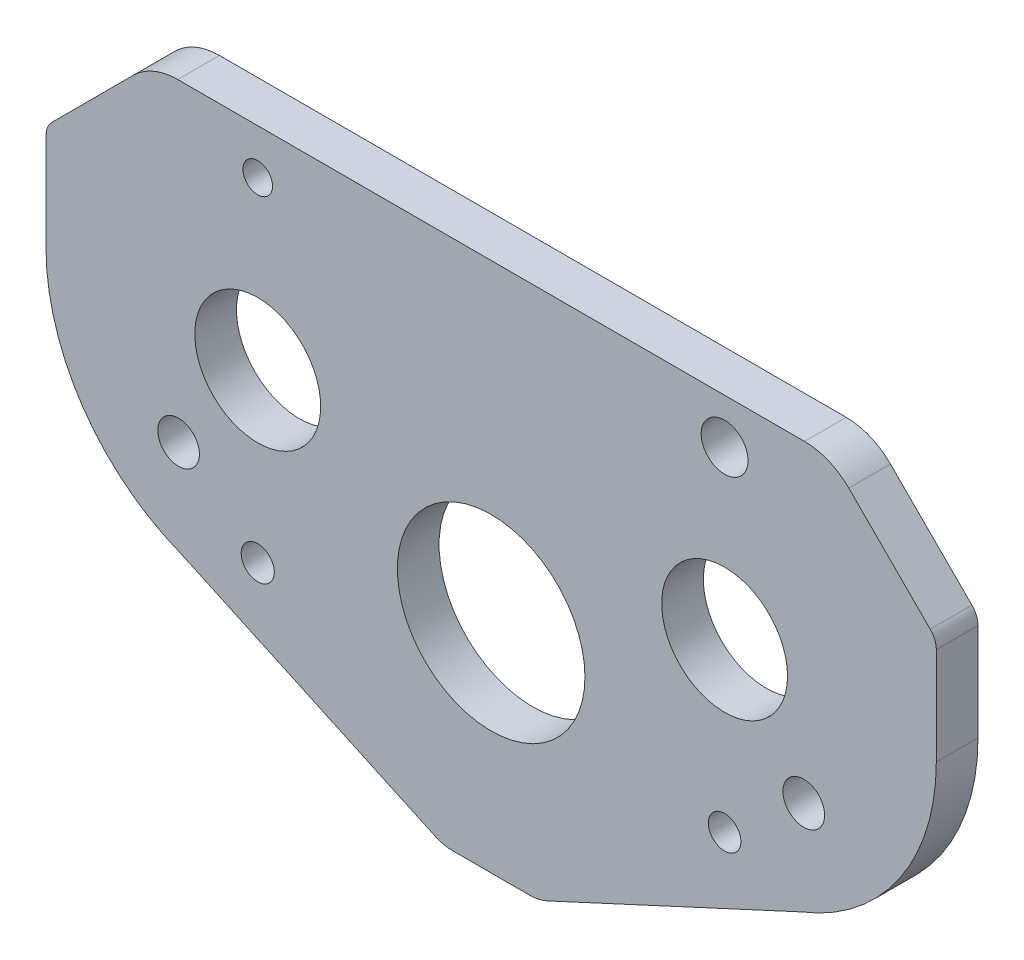
ISO-10303-21;
HEADER;
FILE_DESCRIPTION(('STEP AP214'),'2;1');
FILE_NAME('part.step','',(''),(''),'','','');
FILE_SCHEMA(('AUTOMOTIVE_DESIGN { 1 0 10303 214 1 1 1 1 }'));
ENDSEC;
DATA;
#1=APPLICATION_CONTEXT('core data for automotive mechanical design processes');
#2=APPLICATION_PROTOCOL_DEFINITION('international standard','automotive_design',2000,#1);
#3=PRODUCT_CONTEXT('',#1,'mechanical');
#4=PRODUCT('Part','Part','',(#3));
#5=PRODUCT_RELATED_PRODUCT_CATEGORY('part','',(#4));
#6=PRODUCT_DEFINITION_FORMATION('','',#4);
#7=PRODUCT_DEFINITION_CONTEXT('part definition',#1,'design');
#8=PRODUCT_DEFINITION('design','',#6,#7);
#9=PRODUCT_DEFINITION_SHAPE('','',#8);
#10=(LENGTH_UNIT() NAMED_UNIT(*) SI_UNIT(.MILLI.,.METRE.));
#11=(NAMED_UNIT(*) PLANE_ANGLE_UNIT() SI_UNIT($,.RADIAN.));
#12=(NAMED_UNIT(*) SI_UNIT($,.STERADIAN.) SOLID_ANGLE_UNIT());
#13=UNCERTAINTY_MEASURE_WITH_UNIT(LENGTH_MEASURE(1.E-05),#10,'distance_accuracy_value','');
#14=(GEOMETRIC_REPRESENTATION_CONTEXT(3) GLOBAL_UNCERTAINTY_ASSIGNED_CONTEXT((#13)) GLOBAL_UNIT_ASSIGNED_CONTEXT((#10,
#11,#12)) REPRESENTATION_CONTEXT('',''));
#15=CARTESIAN_POINT('',(0.,0.,0.));
#16=DIRECTION('',(0.,0.,1.));
#17=DIRECTION('',(1.,0.,0.));
#18=AXIS2_PLACEMENT_3D('',#15,#16,#17);
#19=CARTESIAN_POINT('',(35.563882812585,15.5408971662744,3.175));
#20=DIRECTION('',(0.,0.,1.));
#21=DIRECTION('',(1.,0.,0.));
#22=AXIS2_PLACEMENT_3D('',#19,#20,#21);
#23=PLANE('',#22);
#24=CARTESIAN_POINT('',(35.5638828125851,-9.85910283372568,3.175));
#25=DIRECTION('',(0.,0.,1.));
#26=DIRECTION('',(1.,0.,0.));
#27=AXIS2_PLACEMENT_3D('',#24,#25,#26);
#28=CIRCLE('',#27,2.48146877651786);
#29=CARTESIAN_POINT('',(38.045351589103,-9.85910283372568,3.175));
#30=VERTEX_POINT('',#29);
#31=EDGE_CURVE('E599',#30,#30,#28,.T.);
#32=ORIENTED_EDGE('',*,*,#31,.F.);
#33=EDGE_LOOP('',(#32));
#34=FACE_BOUND('',#33,.T.);
#35=CARTESIAN_POINT('',(-35.5638828125851,40.9408971662743,3.175));
#36=DIRECTION('',(0.,0.,1.));
#37=DIRECTION('',(1.,0.,0.));
#38=AXIS2_PLACEMENT_3D('',#35,#36,#37);
#39=CIRCLE('',#38,2.25727893057174);
#40=CARTESIAN_POINT('',(-33.3066038820134,40.9408971662743,3.175));
#41=VERTEX_POINT('',#40);
#42=EDGE_CURVE('E587',#41,#41,#39,.T.);
#43=ORIENTED_EDGE('',*,*,#42,.F.);
#44=EDGE_LOOP('',(#43));
#45=FACE_BOUND('',#44,.T.);
#46=CARTESIAN_POINT('',(-47.625,0.,3.175));
#47=DIRECTION('',(0.,0.,1.));
#48=DIRECTION('',(1.,0.,0.));
#49=AXIS2_PLACEMENT_3D('',#46,#47,#48);
#50=CIRCLE('',#49,3.17500000000001);
#51=CARTESIAN_POINT('',(-44.45,0.,3.175));
#52=VERTEX_POINT('',#51);
#53=EDGE_CURVE('E575',#52,#52,#50,.T.);
#54=ORIENTED_EDGE('',*,*,#53,.F.);
#55=EDGE_LOOP('',(#54));
#56=FACE_BOUND('',#55,.T.);
#57=CARTESIAN_POINT('',(35.5638828125851,15.5408971662743,3.175));
#58=DIRECTION('',(0.,0.,1.));
#59=DIRECTION('',(1.,0.,0.));
#60=AXIS2_PLACEMENT_3D('',#57,#58,#59);
#61=CIRCLE('',#60,9.58850000000001);
#62=CARTESIAN_POINT('',(45.1523828125851,15.5408971662743,3.175));
#63=VERTEX_POINT('',#62);
#64=EDGE_CURVE('E563',#63,#63,#61,.T.);
#65=ORIENTED_EDGE('',*,*,#64,.F.);
#66=EDGE_LOOP('',(#65));
#67=FACE_BOUND('',#66,.T.);
#68=DIRECTION('',(1.,0.,0.));
#69=VECTOR('',#68,1.);
#70=CARTESIAN_POINT('',(-7.26457678024273,-33.02,3.175));
#71=LINE('',#70,#69);
#72=CARTESIAN_POINT('',(-5.86754278404221,-33.02,3.175));
#73=VERTEX_POINT('',#72);
#74=CARTESIAN_POINT('',(5.86754278404219,-33.02,3.175));
#75=VERTEX_POINT('',#74);
#76=EDGE_CURVE('E175',#73,#75,#71,.T.);
#77=ORIENTED_EDGE('',*,*,#76,.T.);
#78=CARTESIAN_POINT('',(5.86754278404219,-26.67,3.175));
#79=DIRECTION('',(0.,0.,1.));
#80=DIRECTION('',(1.,0.,0.));
#81=AXIS2_PLACEMENT_3D('',#78,#79,#80);
#82=CIRCLE('',#81,6.35);
#83=CARTESIAN_POINT('',(8.53261500301202,-32.4336698437432,3.175));
#84=VERTEX_POINT('',#83);
#85=EDGE_CURVE('E41',#75,#84,#82,.T.);
#86=ORIENTED_EDGE('',*,*,#85,.T.);
#87=DIRECTION('',(0.907664542321771,0.419696412436193,0.));
#88=VECTOR('',#87,1.);
#89=CARTESIAN_POINT('',(47.3213543831485,-14.4980846118651,3.175));
#90=LINE('',#89,#88);
#91=CARTESIAN_POINT('',(47.3213543831485,-14.4980846118651,3.175));
#92=VERTEX_POINT('',#91);
#93=EDGE_CURVE('E180',#84,#92,#90,.T.);
#94=ORIENTED_EDGE('',*,*,#93,.T.);
#95=CARTESIAN_POINT('',(35.563882812585,15.5408971662744,3.175));
#96=DIRECTION('',(0.,0.,1.));
#97=DIRECTION('',(1.,0.,0.));
#98=AXIS2_PLACEMENT_3D('',#95,#96,#97);
#99=CIRCLE('',#98,32.2580000000001);
#100=CARTESIAN_POINT('',(67.8218828125851,15.5408971662743,3.175));
#101=VERTEX_POINT('',#100);
#102=EDGE_CURVE('E182',#92,#101,#99,.T.);
#103=ORIENTED_EDGE('',*,*,#102,.T.);
#104=DIRECTION('',(0.,1.,0.));
#105=VECTOR('',#104,1.);
#106=CARTESIAN_POINT('',(67.8218828125851,31.6698971662743,3.175));
#107=LINE('',#106,#105);
#108=CARTESIAN_POINT('',(67.8218828125851,30.3547691057397,3.175));
#109=VERTEX_POINT('',#108);
#110=EDGE_CURVE('E184',#101,#109,#107,.T.);
#111=ORIENTED_EDGE('',*,*,#110,.T.);
#112=CARTESIAN_POINT('',(64.6468828125851,30.3547691057397,3.175));
#113=DIRECTION('',(0.,0.,1.));
#114=DIRECTION('',(1.,0.,0.));
#115=AXIS2_PLACEMENT_3D('',#112,#113,#114);
#116=CIRCLE('',#115,3.175);
#117=CARTESIAN_POINT('',(66.8919468428524,32.599833136007,3.175));
#118=VERTEX_POINT('',#117);
#119=EDGE_CURVE('E249',#109,#118,#116,.T.);
#120=ORIENTED_EDGE('',*,*,#119,.T.);
#121=DIRECTION('',(-0.707106781186548,0.707106781186548,0.));
#122=VECTOR('',#121,1.);
#123=CARTESIAN_POINT('',(51.6928828125851,47.7988971662743,3.175));
#124=LINE('',#123,#122);
#125=CARTESIAN_POINT('',(54.4826907217832,45.0090892570762,3.175));
#126=VERTEX_POINT('',#125);
#127=EDGE_CURVE('E187',#118,#126,#124,.T.);
#128=ORIENTED_EDGE('',*,*,#127,.T.);
#129=CARTESIAN_POINT('',(47.7474986309814,38.2738971662743,3.175));
#130=DIRECTION('',(0.,0.,1.));
#131=DIRECTION('',(1.,0.,0.));
#132=AXIS2_PLACEMENT_3D('',#129,#130,#131);
#133=CIRCLE('',#132,9.525);
#134=CARTESIAN_POINT('',(47.7474986309813,47.7988971662743,3.175));
#135=VERTEX_POINT('',#134);
#136=EDGE_CURVE('E234',#126,#135,#133,.T.);
#137=ORIENTED_EDGE('',*,*,#136,.T.);
#138=DIRECTION('',(-1.,0.,0.));
#139=VECTOR('',#138,1.);
#140=CARTESIAN_POINT('',(-51.6928828125851,47.7988971662743,3.175));
#141=LINE('',#140,#139);
#142=CARTESIAN_POINT('',(-47.7474986309814,47.7988971662743,3.175));
#143=VERTEX_POINT('',#142);
#144=EDGE_CURVE('E213',#135,#143,#141,.T.);
#145=ORIENTED_EDGE('',*,*,#144,.T.);
#146=CARTESIAN_POINT('',(-47.7474986309814,38.2738971662743,3.175));
#147=DIRECTION('',(0.,0.,1.));
#148=DIRECTION('',(1.,0.,0.));
#149=AXIS2_PLACEMENT_3D('',#146,#147,#148);
#150=CIRCLE('',#149,9.525);
#151=CARTESIAN_POINT('',(-54.4826907217832,45.0090892570762,3.175));
#152=VERTEX_POINT('',#151);
#153=EDGE_CURVE('E232',#143,#152,#150,.T.);
#154=ORIENTED_EDGE('',*,*,#153,.T.);
#155=DIRECTION('',(-0.707106781186548,-0.707106781186548,0.));
#156=VECTOR('',#155,1.);
#157=CARTESIAN_POINT('',(-67.8218828125851,31.6698971662743,3.175));
#158=LINE('',#157,#156);
#159=CARTESIAN_POINT('',(-66.8919468428524,32.599833136007,3.175));
#160=VERTEX_POINT('',#159);
#161=EDGE_CURVE('E159',#152,#160,#158,.T.);
#162=ORIENTED_EDGE('',*,*,#161,.T.);
#163=CARTESIAN_POINT('',(-64.6468828125851,30.3547691057397,3.175));
#164=DIRECTION('',(0.,0.,1.));
#165=DIRECTION('',(1.,0.,0.));
#166=AXIS2_PLACEMENT_3D('',#163,#164,#165);
#167=CIRCLE('',#166,3.175);
#168=CARTESIAN_POINT('',(-67.8218828125851,30.3547691057397,3.175));
#169=VERTEX_POINT('',#168);
#170=EDGE_CURVE('E155',#160,#169,#167,.T.);
#171=ORIENTED_EDGE('',*,*,#170,.T.);
#172=DIRECTION('',(0.,-1.,0.));
#173=VECTOR('',#172,1.);
#174=CARTESIAN_POINT('',(-67.8218828125851,15.5408971662743,3.175));
#175=LINE('',#174,#173);
#176=CARTESIAN_POINT('',(-67.8218828125851,15.5408971662743,3.175));
#177=VERTEX_POINT('',#176);
#178=EDGE_CURVE('E147',#169,#177,#175,.T.);
#179=ORIENTED_EDGE('',*,*,#178,.T.);
#180=CARTESIAN_POINT('',(-35.5638828125849,15.5408971662744,3.175));
#181=DIRECTION('',(0.,0.,1.));
#182=DIRECTION('',(-1.,0.,0.));
#183=AXIS2_PLACEMENT_3D('',#180,#181,#182);
#184=CIRCLE('',#183,32.2580000000002);
#185=CARTESIAN_POINT('',(-47.3213543831485,-14.4980846118651,3.175));
#186=VERTEX_POINT('',#185);
#187=EDGE_CURVE('E151',#177,#186,#184,.T.);
#188=ORIENTED_EDGE('',*,*,#187,.T.);
#189=DIRECTION('',(0.90766454232177,-0.419696412436193,0.));
#190=VECTOR('',#189,1.);
#191=CARTESIAN_POINT('',(-47.3213543831485,-14.4980846118651,3.175));
#192=LINE('',#191,#190);
#193=CARTESIAN_POINT('',(-8.53261500301204,-32.4336698437432,3.175));
#194=VERTEX_POINT('',#193);
#195=EDGE_CURVE('E173',#186,#194,#192,.T.);
#196=ORIENTED_EDGE('',*,*,#195,.T.);
#197=CARTESIAN_POINT('',(-5.86754278404221,-26.67,3.175));
#198=DIRECTION('',(0.,0.,1.));
#199=DIRECTION('',(1.,0.,0.));
#200=AXIS2_PLACEMENT_3D('',#197,#198,#199);
#201=CIRCLE('',#200,6.35);
#202=EDGE_CURVE('E266',#194,#73,#201,.T.);
#203=ORIENTED_EDGE('',*,*,#202,.T.);
#204=EDGE_LOOP('',(#77,#86,#94,#103,#111,#120,#128,#137,#145,#154,#162,#171,#179,#188,#196,#203));
#205=FACE_BOUND('',#204,.T.);
#206=CARTESIAN_POINT('',(0.,0.,3.175));
#207=DIRECTION('',(0.,0.,1.));
#208=DIRECTION('',(1.,0.,0.));
#209=AXIS2_PLACEMENT_3D('',#206,#207,#208);
#210=CIRCLE('',#209,14.2875);
#211=CARTESIAN_POINT('',(14.2875,0.,3.175));
#212=VERTEX_POINT('',#211);
#213=EDGE_CURVE('E193',#212,#212,#210,.T.);
#214=ORIENTED_EDGE('',*,*,#213,.F.);
#215=EDGE_LOOP('',(#214));
#216=FACE_BOUND('',#215,.T.);
#217=CARTESIAN_POINT('',(-35.5638828125851,15.5408971662743,3.175));
#218=DIRECTION('',(0.,0.,1.));
#219=DIRECTION('',(1.,0.,0.));
#220=AXIS2_PLACEMENT_3D('',#217,#218,#219);
#221=CIRCLE('',#220,9.5885);
#222=CARTESIAN_POINT('',(-25.9753828125851,15.5408971662743,3.175));
#223=VERTEX_POINT('',#222);
#224=EDGE_CURVE('E569',#223,#223,#221,.T.);
#225=ORIENTED_EDGE('',*,*,#224,.F.);
#226=EDGE_LOOP('',(#225));
#227=FACE_BOUND('',#226,.T.);
#228=CARTESIAN_POINT('',(47.625,0.,3.175));
#229=DIRECTION('',(0.,0.,1.));
#230=DIRECTION('',(1.,0.,0.));
#231=AXIS2_PLACEMENT_3D('',#228,#229,#230);
#232=CIRCLE('',#231,3.17500000000001);
#233=CARTESIAN_POINT('',(50.8,0.,3.175));
#234=VERTEX_POINT('',#233);
#235=EDGE_CURVE('E581',#234,#234,#232,.T.);
#236=ORIENTED_EDGE('',*,*,#235,.F.);
#237=EDGE_LOOP('',(#236));
#238=FACE_BOUND('',#237,.T.);
#239=CARTESIAN_POINT('',(-35.5638828125851,-9.85910283372568,3.175));
#240=DIRECTION('',(0.,0.,1.));
#241=DIRECTION('',(1.,0.,0.));
#242=AXIS2_PLACEMENT_3D('',#239,#240,#241);
#243=CIRCLE('',#242,2.5219894842726);
#244=CARTESIAN_POINT('',(-33.0418933283125,-9.85910283372568,3.175));
#245=VERTEX_POINT('',#244);
#246=EDGE_CURVE('E593',#245,#245,#243,.T.);
#247=ORIENTED_EDGE('',*,*,#246,.F.);
#248=EDGE_LOOP('',(#247));
#249=FACE_BOUND('',#248,.T.);
#250=CARTESIAN_POINT('',(35.5638828125851,40.9408971662743,3.175));
#251=DIRECTION('',(0.,0.,1.));
#252=DIRECTION('',(1.,0.,0.));
#253=AXIS2_PLACEMENT_3D('',#250,#251,#252);
#254=CIRCLE('',#253,3.56711136624443);
#255=CARTESIAN_POINT('',(39.1309941788295,40.9408971662743,3.175));
#256=VERTEX_POINT('',#255);
#257=EDGE_CURVE('E605',#256,#256,#254,.T.);
#258=ORIENTED_EDGE('',*,*,#257,.F.);
#259=EDGE_LOOP('',(#258));
#260=FACE_BOUND('',#259,.T.);
#261=ADVANCED_FACE('F33',(#34,#45,#56,#67,#205,#216,#227,#238,#249,#260),#23,.T.);
#262=CARTESIAN_POINT('',(35.563882812585,15.5408971662744,-3.175));
#263=DIRECTION('',(0.,0.,1.));
#264=DIRECTION('',(1.,0.,0.));
#265=AXIS2_PLACEMENT_3D('',#262,#263,#264);
#266=PLANE('',#265);
#267=CARTESIAN_POINT('',(35.5638828125851,-9.85910283372568,-3.175));
#268=DIRECTION('',(0.,0.,1.));
#269=DIRECTION('',(1.,0.,0.));
#270=AXIS2_PLACEMENT_3D('',#267,#268,#269);
#271=CIRCLE('',#270,2.48146877651786);
#272=CARTESIAN_POINT('',(38.045351589103,-9.85910283372568,-3.175));
#273=VERTEX_POINT('',#272);
#274=EDGE_CURVE('E602',#273,#273,#271,.T.);
#275=ORIENTED_EDGE('',*,*,#274,.T.);
#276=EDGE_LOOP('',(#275));
#277=FACE_BOUND('',#276,.T.);
#278=CARTESIAN_POINT('',(-35.5638828125851,40.9408971662743,-3.175));
#279=DIRECTION('',(0.,0.,1.));
#280=DIRECTION('',(1.,0.,0.));
#281=AXIS2_PLACEMENT_3D('',#278,#279,#280);
#282=CIRCLE('',#281,2.25727893057174);
#283=CARTESIAN_POINT('',(-33.3066038820134,40.9408971662743,-3.175));
#284=VERTEX_POINT('',#283);
#285=EDGE_CURVE('E590',#284,#284,#282,.T.);
#286=ORIENTED_EDGE('',*,*,#285,.T.);
#287=EDGE_LOOP('',(#286));
#288=FACE_BOUND('',#287,.T.);
#289=CARTESIAN_POINT('',(-47.625,0.,-3.175));
#290=DIRECTION('',(0.,0.,1.));
#291=DIRECTION('',(1.,0.,0.));
#292=AXIS2_PLACEMENT_3D('',#289,#290,#291);
#293=CIRCLE('',#292,3.17500000000001);
#294=CARTESIAN_POINT('',(-44.45,0.,-3.175));
#295=VERTEX_POINT('',#294);
#296=EDGE_CURVE('E578',#295,#295,#293,.T.);
#297=ORIENTED_EDGE('',*,*,#296,.T.);
#298=EDGE_LOOP('',(#297));
#299=FACE_BOUND('',#298,.T.);
#300=CARTESIAN_POINT('',(35.5638828125851,15.5408971662743,-3.175));
#301=DIRECTION('',(0.,0.,1.));
#302=DIRECTION('',(1.,0.,0.));
#303=AXIS2_PLACEMENT_3D('',#300,#301,#302);
#304=CIRCLE('',#303,9.58850000000001);
#305=CARTESIAN_POINT('',(45.1523828125851,15.5408971662743,-3.175));
#306=VERTEX_POINT('',#305);
#307=EDGE_CURVE('E566',#306,#306,#304,.T.);
#308=ORIENTED_EDGE('',*,*,#307,.T.);
#309=EDGE_LOOP('',(#308));
#310=FACE_BOUND('',#309,.T.);
#311=DIRECTION('',(0.907664542321771,0.419696412436193,0.));
#312=VECTOR('',#311,1.);
#313=CARTESIAN_POINT('',(47.3213543831485,-14.4980846118651,-3.175));
#314=LINE('',#313,#312);
#315=CARTESIAN_POINT('',(8.53261500301202,-32.4336698437432,-3.175));
#316=VERTEX_POINT('',#315);
#317=CARTESIAN_POINT('',(47.3213543831485,-14.4980846118651,-3.175));
#318=VERTEX_POINT('',#317);
#319=EDGE_CURVE('E201',#316,#318,#314,.T.);
#320=ORIENTED_EDGE('',*,*,#319,.F.);
#321=CARTESIAN_POINT('',(5.86754278404219,-26.67,-3.175));
#322=DIRECTION('',(0.,0.,1.));
#323=DIRECTION('',(1.,0.,0.));
#324=AXIS2_PLACEMENT_3D('',#321,#322,#323);
#325=CIRCLE('',#324,6.35);
#326=CARTESIAN_POINT('',(5.86754278404219,-33.02,-3.175));
#327=VERTEX_POINT('',#326);
#328=EDGE_CURVE('E260',#316,#327,#325,.F.);
#329=ORIENTED_EDGE('',*,*,#328,.T.);
#330=DIRECTION('',(1.,0.,0.));
#331=VECTOR('',#330,1.);
#332=CARTESIAN_POINT('',(-7.26457678024273,-33.02,-3.175));
#333=LINE('',#332,#331);
#334=CARTESIAN_POINT('',(-5.86754278404221,-33.02,-3.175));
#335=VERTEX_POINT('',#334);
#336=EDGE_CURVE('E199',#335,#327,#333,.T.);
#337=ORIENTED_EDGE('',*,*,#336,.F.);
#338=CARTESIAN_POINT('',(-5.86754278404221,-26.67,-3.175));
#339=DIRECTION('',(0.,0.,1.));
#340=DIRECTION('',(1.,0.,0.));
#341=AXIS2_PLACEMENT_3D('',#338,#339,#340);
#342=CIRCLE('',#341,6.35);
#343=CARTESIAN_POINT('',(-8.53261500301204,-32.4336698437432,-3.175));
#344=VERTEX_POINT('',#343);
#345=EDGE_CURVE('E258',#335,#344,#342,.F.);
#346=ORIENTED_EDGE('',*,*,#345,.T.);
#347=DIRECTION('',(0.90766454232177,-0.419696412436193,0.));
#348=VECTOR('',#347,1.);
#349=CARTESIAN_POINT('',(-47.3213543831485,-14.4980846118651,-3.175));
#350=LINE('',#349,#348);
#351=CARTESIAN_POINT('',(-47.3213543831485,-14.4980846118651,-3.175));
#352=VERTEX_POINT('',#351);
#353=EDGE_CURVE('E197',#352,#344,#350,.T.);
#354=ORIENTED_EDGE('',*,*,#353,.F.);
#355=CARTESIAN_POINT('',(-35.5638828125849,15.5408971662744,-3.175));
#356=DIRECTION('',(0.,0.,1.));
#357=DIRECTION('',(-1.,0.,0.));
#358=AXIS2_PLACEMENT_3D('',#355,#356,#357);
#359=CIRCLE('',#358,32.2580000000002);
#360=CARTESIAN_POINT('',(-67.8218828125851,15.5408971662743,-3.175));
#361=VERTEX_POINT('',#360);
#362=EDGE_CURVE('E195',#361,#352,#359,.T.);
#363=ORIENTED_EDGE('',*,*,#362,.F.);
#364=DIRECTION('',(0.,-1.,0.));
#365=VECTOR('',#364,1.);
#366=CARTESIAN_POINT('',(-67.8218828125851,15.5408971662743,-3.175));
#367=LINE('',#366,#365);
#368=CARTESIAN_POINT('',(-67.8218828125851,30.3547691057397,-3.175));
#369=VERTEX_POINT('',#368);
#370=EDGE_CURVE('E165',#369,#361,#367,.T.);
#371=ORIENTED_EDGE('',*,*,#370,.F.);
#372=CARTESIAN_POINT('',(-64.6468828125851,30.3547691057397,-3.175));
#373=DIRECTION('',(0.,0.,1.));
#374=DIRECTION('',(1.,0.,0.));
#375=AXIS2_PLACEMENT_3D('',#372,#373,#374);
#376=CIRCLE('',#375,3.175);
#377=CARTESIAN_POINT('',(-66.8919468428524,32.599833136007,-3.175));
#378=VERTEX_POINT('',#377);
#379=EDGE_CURVE('E242',#369,#378,#376,.F.);
#380=ORIENTED_EDGE('',*,*,#379,.T.);
#381=DIRECTION('',(-0.707106781186548,-0.707106781186548,0.));
#382=VECTOR('',#381,1.);
#383=CARTESIAN_POINT('',(-67.8218828125851,31.6698971662743,-3.175));
#384=LINE('',#383,#382);
#385=CARTESIAN_POINT('',(-54.4826907217832,45.0090892570762,-3.175));
#386=VERTEX_POINT('',#385);
#387=EDGE_CURVE('E190',#386,#378,#384,.T.);
#388=ORIENTED_EDGE('',*,*,#387,.F.);
#389=CARTESIAN_POINT('',(-47.7474986309814,38.2738971662743,-3.175));
#390=DIRECTION('',(0.,0.,1.));
#391=DIRECTION('',(1.,0.,0.));
#392=AXIS2_PLACEMENT_3D('',#389,#390,#391);
#393=CIRCLE('',#392,9.525);
#394=CARTESIAN_POINT('',(-47.7474986309814,47.7988971662743,-3.175));
#395=VERTEX_POINT('',#394);
#396=EDGE_CURVE('E224',#386,#395,#393,.F.);
#397=ORIENTED_EDGE('',*,*,#396,.T.);
#398=DIRECTION('',(-1.,0.,0.));
#399=VECTOR('',#398,1.);
#400=CARTESIAN_POINT('',(-35.5638828125851,47.7988971662743,-3.175));
#401=LINE('',#400,#399);
#402=CARTESIAN_POINT('',(47.7474986309814,47.7988971662743,-3.175));
#403=VERTEX_POINT('',#402);
#404=EDGE_CURVE('E210',#403,#395,#401,.T.);
#405=ORIENTED_EDGE('',*,*,#404,.F.);
#406=CARTESIAN_POINT('',(47.7474986309814,38.2738971662743,-3.175));
#407=DIRECTION('',(0.,0.,1.));
#408=DIRECTION('',(1.,0.,0.));
#409=AXIS2_PLACEMENT_3D('',#406,#407,#408);
#410=CIRCLE('',#409,9.525);
#411=CARTESIAN_POINT('',(54.4826907217832,45.0090892570762,-3.175));
#412=VERTEX_POINT('',#411);
#413=EDGE_CURVE('E226',#403,#412,#410,.F.);
#414=ORIENTED_EDGE('',*,*,#413,.T.);
#415=DIRECTION('',(-0.707106781186548,0.707106781186548,0.));
#416=VECTOR('',#415,1.);
#417=CARTESIAN_POINT('',(51.6928828125851,47.7988971662743,-3.175));
#418=LINE('',#417,#416);
#419=CARTESIAN_POINT('',(66.8919468428524,32.599833136007,-3.175));
#420=VERTEX_POINT('',#419);
#421=EDGE_CURVE('E208',#420,#412,#418,.T.);
#422=ORIENTED_EDGE('',*,*,#421,.F.);
#423=CARTESIAN_POINT('',(64.6468828125851,30.3547691057397,-3.175));
#424=DIRECTION('',(0.,0.,1.));
#425=DIRECTION('',(1.,0.,0.));
#426=AXIS2_PLACEMENT_3D('',#423,#424,#425);
#427=CIRCLE('',#426,3.175);
#428=CARTESIAN_POINT('',(67.8218828125851,30.3547691057397,-3.175));
#429=VERTEX_POINT('',#428);
#430=EDGE_CURVE('E244',#420,#429,#427,.F.);
#431=ORIENTED_EDGE('',*,*,#430,.T.);
#432=DIRECTION('',(0.,1.,0.));
#433=VECTOR('',#432,1.);
#434=CARTESIAN_POINT('',(67.8218828125851,31.6698971662743,-3.175));
#435=LINE('',#434,#433);
#436=CARTESIAN_POINT('',(67.8218828125851,15.5408971662743,-3.175));
#437=VERTEX_POINT('',#436);
#438=EDGE_CURVE('E205',#437,#429,#435,.T.);
#439=ORIENTED_EDGE('',*,*,#438,.F.);
#440=CARTESIAN_POINT('',(35.563882812585,15.5408971662744,-3.175));
#441=DIRECTION('',(0.,0.,1.));
#442=DIRECTION('',(1.,0.,0.));
#443=AXIS2_PLACEMENT_3D('',#440,#441,#442);
#444=CIRCLE('',#443,32.2580000000001);
#445=EDGE_CURVE('E203',#318,#437,#444,.T.);
#446=ORIENTED_EDGE('',*,*,#445,.F.);
#447=EDGE_LOOP('',(#320,#329,#337,#346,#354,#363,#371,#380,#388,#397,#405,#414,#422,#431,#439,#446));
#448=FACE_BOUND('',#447,.T.);
#449=CARTESIAN_POINT('',(0.,0.,-3.175));
#450=DIRECTION('',(0.,0.,1.));
#451=DIRECTION('',(1.,0.,0.));
#452=AXIS2_PLACEMENT_3D('',#449,#450,#451);
#453=CIRCLE('',#452,14.2875);
#454=CARTESIAN_POINT('',(14.2875,0.,-3.175));
#455=VERTEX_POINT('',#454);
#456=EDGE_CURVE('E560',#455,#455,#453,.T.);
#457=ORIENTED_EDGE('',*,*,#456,.T.);
#458=EDGE_LOOP('',(#457));
#459=FACE_BOUND('',#458,.T.);
#460=CARTESIAN_POINT('',(-35.5638828125851,15.5408971662743,-3.175));
#461=DIRECTION('',(0.,0.,1.));
#462=DIRECTION('',(1.,0.,0.));
#463=AXIS2_PLACEMENT_3D('',#460,#461,#462);
#464=CIRCLE('',#463,9.5885);
#465=CARTESIAN_POINT('',(-25.9753828125851,15.5408971662743,-3.175));
#466=VERTEX_POINT('',#465);
#467=EDGE_CURVE('E572',#466,#466,#464,.T.);
#468=ORIENTED_EDGE('',*,*,#467,.T.);
#469=EDGE_LOOP('',(#468));
#470=FACE_BOUND('',#469,.T.);
#471=CARTESIAN_POINT('',(47.625,0.,-3.175));
#472=DIRECTION('',(0.,0.,1.));
#473=DIRECTION('',(1.,0.,0.));
#474=AXIS2_PLACEMENT_3D('',#471,#472,#473);
#475=CIRCLE('',#474,3.17500000000001);
#476=CARTESIAN_POINT('',(50.8,0.,-3.175));
#477=VERTEX_POINT('',#476);
#478=EDGE_CURVE('E584',#477,#477,#475,.T.);
#479=ORIENTED_EDGE('',*,*,#478,.T.);
#480=EDGE_LOOP('',(#479));
#481=FACE_BOUND('',#480,.T.);
#482=CARTESIAN_POINT('',(-35.5638828125851,-9.85910283372568,-3.175));
#483=DIRECTION('',(0.,0.,1.));
#484=DIRECTION('',(1.,0.,0.));
#485=AXIS2_PLACEMENT_3D('',#482,#483,#484);
#486=CIRCLE('',#485,2.5219894842726);
#487=CARTESIAN_POINT('',(-33.0418933283125,-9.85910283372568,-3.175));
#488=VERTEX_POINT('',#487);
#489=EDGE_CURVE('E596',#488,#488,#486,.T.);
#490=ORIENTED_EDGE('',*,*,#489,.T.);
#491=EDGE_LOOP('',(#490));
#492=FACE_BOUND('',#491,.T.);
#493=CARTESIAN_POINT('',(35.5638828125851,40.9408971662743,-3.175));
#494=DIRECTION('',(0.,0.,1.));
#495=DIRECTION('',(1.,0.,0.));
#496=AXIS2_PLACEMENT_3D('',#493,#494,#495);
#497=CIRCLE('',#496,3.56711136624443);
#498=CARTESIAN_POINT('',(39.1309941788295,40.9408971662743,-3.175));
#499=VERTEX_POINT('',#498);
#500=EDGE_CURVE('E608',#499,#499,#497,.T.);
#501=ORIENTED_EDGE('',*,*,#500,.T.);
#502=EDGE_LOOP('',(#501));
#503=FACE_BOUND('',#502,.T.);
#504=ADVANCED_FACE('F279',(#277,#288,#299,#310,#448,#459,#470,#481,#492,#503),#266,.F.);
#505=CARTESIAN_POINT('',(-67.8218828125851,31.6698971662743,3.175));
#506=DIRECTION('',(0.707106781186548,-0.707106781186548,0.));
#507=DIRECTION('',(0.707106781186548,0.707106781186548,0.));
#508=AXIS2_PLACEMENT_3D('',#505,#506,#507);
#509=PLANE('',#508);
#510=ORIENTED_EDGE('',*,*,#387,.T.);
#511=DIRECTION('',(0.,0.,-1.));
#512=VECTOR('',#511,1.);
#513=CARTESIAN_POINT('',(-66.8919468428524,32.599833136007,3.175));
#514=LINE('',#513,#512);
#515=EDGE_CURVE('E253',#378,#160,#514,.F.);
#516=ORIENTED_EDGE('',*,*,#515,.T.);
#517=ORIENTED_EDGE('',*,*,#161,.F.);
#518=DIRECTION('',(0.,0.,-1.));
#519=VECTOR('',#518,1.);
#520=CARTESIAN_POINT('',(-54.4826907217832,45.0090892570762,3.175));
#521=LINE('',#520,#519);
#522=EDGE_CURVE('E236',#152,#386,#521,.T.);
#523=ORIENTED_EDGE('',*,*,#522,.T.);
#524=EDGE_LOOP('',(#510,#516,#517,#523));
#525=FACE_BOUND('',#524,.T.);
#526=ADVANCED_FACE('F302',(#525),#509,.F.);
#527=CARTESIAN_POINT('',(-67.8218828125851,15.5408971662743,3.175));
#528=DIRECTION('',(1.,0.,0.));
#529=DIRECTION('',(0.,0.,-1.));
#530=AXIS2_PLACEMENT_3D('',#527,#528,#529);
#531=PLANE('',#530);
#532=ORIENTED_EDGE('',*,*,#178,.F.);
#533=DIRECTION('',(0.,0.,-1.));
#534=VECTOR('',#533,1.);
#535=CARTESIAN_POINT('',(-67.8218828125851,30.3547691057397,3.175));
#536=LINE('',#535,#534);
#537=EDGE_CURVE('E251',#169,#369,#536,.T.);
#538=ORIENTED_EDGE('',*,*,#537,.T.);
#539=ORIENTED_EDGE('',*,*,#370,.T.);
#540=DIRECTION('',(0.,0.,-1.));
#541=VECTOR('',#540,1.);
#542=CARTESIAN_POINT('',(-67.8218828125851,15.5408971662743,3.175));
#543=LINE('',#542,#541);
#544=EDGE_CURVE('E162',#177,#361,#543,.T.);
#545=ORIENTED_EDGE('',*,*,#544,.F.);
#546=EDGE_LOOP('',(#532,#538,#539,#545));
#547=FACE_BOUND('',#546,.T.);
#548=ADVANCED_FACE('F163',(#547),#531,.F.);
#549=CARTESIAN_POINT('',(-35.5638828125849,15.5408971662744,3.175));
#550=DIRECTION('',(0.,0.,-1.));
#551=DIRECTION('',(-1.,0.,0.));
#552=AXIS2_PLACEMENT_3D('',#549,#550,#551);
#553=CYLINDRICAL_SURFACE('',#552,32.2580000000002);
#554=ORIENTED_EDGE('',*,*,#362,.T.);
#555=DIRECTION('',(0.,0.,-1.));
#556=VECTOR('',#555,1.);
#557=CARTESIAN_POINT('',(-47.3213543831485,-14.4980846118651,3.175));
#558=LINE('',#557,#556);
#559=EDGE_CURVE('E169',#186,#352,#558,.T.);
#560=ORIENTED_EDGE('',*,*,#559,.F.);
#561=ORIENTED_EDGE('',*,*,#187,.F.);
#562=ORIENTED_EDGE('',*,*,#544,.T.);
#563=EDGE_LOOP('',(#554,#560,#561,#562));
#564=FACE_BOUND('',#563,.T.);
#565=ADVANCED_FACE('F171',(#564),#553,.T.);
#566=CARTESIAN_POINT('',(-47.3213543831485,-14.4980846118651,3.175));
#567=DIRECTION('',(0.419696412436193,0.90766454232177,0.));
#568=DIRECTION('',(-0.907664542321771,0.419696412436193,0.));
#569=AXIS2_PLACEMENT_3D('',#566,#567,#568);
#570=PLANE('',#569);
#571=ORIENTED_EDGE('',*,*,#353,.T.);
#572=DIRECTION('',(0.,0.,-1.));
#573=VECTOR('',#572,1.);
#574=CARTESIAN_POINT('',(-8.53261500301204,-32.4336698437432,3.175));
#575=LINE('',#574,#573);
#576=EDGE_CURVE('E11',#344,#194,#575,.F.);
#577=ORIENTED_EDGE('',*,*,#576,.T.);
#578=ORIENTED_EDGE('',*,*,#195,.F.);
#579=ORIENTED_EDGE('',*,*,#559,.T.);
#580=EDGE_LOOP('',(#571,#577,#578,#579));
#581=FACE_BOUND('',#580,.T.);
#582=ADVANCED_FACE('F287',(#581),#570,.F.);
#583=CARTESIAN_POINT('',(-7.26457678024273,-33.02,3.175));
#584=DIRECTION('',(0.,1.,0.));
#585=DIRECTION('',(0.,0.,1.));
#586=AXIS2_PLACEMENT_3D('',#583,#584,#585);
#587=PLANE('',#586);
#588=ORIENTED_EDGE('',*,*,#336,.T.);
#589=DIRECTION('',(0.,0.,-1.));
#590=VECTOR('',#589,1.);
#591=CARTESIAN_POINT('',(5.86754278404219,-33.02,3.175));
#592=LINE('',#591,#590);
#593=EDGE_CURVE('E54',#327,#75,#592,.F.);
#594=ORIENTED_EDGE('',*,*,#593,.T.);
#595=ORIENTED_EDGE('',*,*,#76,.F.);
#596=DIRECTION('',(0.,0.,-1.));
#597=VECTOR('',#596,1.);
#598=CARTESIAN_POINT('',(-5.86754278404221,-33.02,3.175));
#599=LINE('',#598,#597);
#600=EDGE_CURVE('E262',#73,#335,#599,.T.);
#601=ORIENTED_EDGE('',*,*,#600,.T.);
#602=EDGE_LOOP('',(#588,#594,#595,#601));
#603=FACE_BOUND('',#602,.T.);
#604=ADVANCED_FACE('F282',(#603),#587,.F.);
#605=CARTESIAN_POINT('',(47.3213543831485,-14.4980846118651,3.175));
#606=DIRECTION('',(-0.419696412436193,0.90766454232177,0.));
#607=DIRECTION('',(-0.907664542321771,-0.419696412436193,0.));
#608=AXIS2_PLACEMENT_3D('',#605,#606,#607);
#609=PLANE('',#608);
#610=ORIENTED_EDGE('',*,*,#93,.F.);
#611=DIRECTION('',(0.,0.,-1.));
#612=VECTOR('',#611,1.);
#613=CARTESIAN_POINT('',(8.53261500301202,-32.4336698437432,3.175));
#614=LINE('',#613,#612);
#615=EDGE_CURVE('E255',#84,#316,#614,.T.);
#616=ORIENTED_EDGE('',*,*,#615,.T.);
#617=ORIENTED_EDGE('',*,*,#319,.T.);
#618=DIRECTION('',(0.,0.,-1.));
#619=VECTOR('',#618,1.);
#620=CARTESIAN_POINT('',(47.3213543831485,-14.4980846118651,3.175));
#621=LINE('',#620,#619);
#622=EDGE_CURVE('E216',#92,#318,#621,.T.);
#623=ORIENTED_EDGE('',*,*,#622,.F.);
#624=EDGE_LOOP('',(#610,#616,#617,#623));
#625=FACE_BOUND('',#624,.T.);
#626=ADVANCED_FACE('F273',(#625),#609,.F.);
#627=CARTESIAN_POINT('',(35.563882812585,15.5408971662744,3.175));
#628=DIRECTION('',(0.,0.,-1.));
#629=DIRECTION('',(-1.,0.,0.));
#630=AXIS2_PLACEMENT_3D('',#627,#628,#629);
#631=CYLINDRICAL_SURFACE('',#630,32.2580000000001);
#632=ORIENTED_EDGE('',*,*,#445,.T.);
#633=DIRECTION('',(0.,0.,-1.));
#634=VECTOR('',#633,1.);
#635=CARTESIAN_POINT('',(67.8218828125851,15.5408971662743,3.175));
#636=LINE('',#635,#634);
#637=EDGE_CURVE('E189',#101,#437,#636,.T.);
#638=ORIENTED_EDGE('',*,*,#637,.F.);
#639=ORIENTED_EDGE('',*,*,#102,.F.);
#640=ORIENTED_EDGE('',*,*,#622,.T.);
#641=EDGE_LOOP('',(#632,#638,#639,#640));
#642=FACE_BOUND('',#641,.T.);
#643=ADVANCED_FACE('F322',(#642),#631,.T.);
#644=CARTESIAN_POINT('',(67.8218828125851,31.6698971662743,3.175));
#645=DIRECTION('',(-1.,0.,0.));
#646=DIRECTION('',(0.,0.,1.));
#647=AXIS2_PLACEMENT_3D('',#644,#645,#646);
#648=PLANE('',#647);
#649=ORIENTED_EDGE('',*,*,#438,.T.);
#650=DIRECTION('',(0.,0.,-1.));
#651=VECTOR('',#650,1.);
#652=CARTESIAN_POINT('',(67.8218828125851,30.3547691057397,3.175));
#653=LINE('',#652,#651);
#654=EDGE_CURVE('E246',#429,#109,#653,.F.);
#655=ORIENTED_EDGE('',*,*,#654,.T.);
#656=ORIENTED_EDGE('',*,*,#110,.F.);
#657=ORIENTED_EDGE('',*,*,#637,.T.);
#658=EDGE_LOOP('',(#649,#655,#656,#657));
#659=FACE_BOUND('',#658,.T.);
#660=ADVANCED_FACE('F318',(#659),#648,.F.);
#661=CARTESIAN_POINT('',(51.6928828125851,47.7988971662743,3.175));
#662=DIRECTION('',(-0.707106781186548,-0.707106781186548,0.));
#663=DIRECTION('',(0.707106781186548,-0.707106781186548,0.));
#664=AXIS2_PLACEMENT_3D('',#661,#662,#663);
#665=PLANE('',#664);
#666=ORIENTED_EDGE('',*,*,#127,.F.);
#667=DIRECTION('',(0.,0.,-1.));
#668=VECTOR('',#667,1.);
#669=CARTESIAN_POINT('',(66.8919468428524,32.599833136007,3.175));
#670=LINE('',#669,#668);
#671=EDGE_CURVE('E239',#118,#420,#670,.T.);
#672=ORIENTED_EDGE('',*,*,#671,.T.);
#673=ORIENTED_EDGE('',*,*,#421,.T.);
#674=DIRECTION('',(0.,0.,-1.));
#675=VECTOR('',#674,1.);
#676=CARTESIAN_POINT('',(54.4826907217832,45.0090892570762,3.175));
#677=LINE('',#676,#675);
#678=EDGE_CURVE('E229',#412,#126,#677,.F.);
#679=ORIENTED_EDGE('',*,*,#678,.T.);
#680=EDGE_LOOP('',(#666,#672,#673,#679));
#681=FACE_BOUND('',#680,.T.);
#682=ADVANCED_FACE('F314',(#681),#665,.F.);
#683=CARTESIAN_POINT('',(-35.5638828125851,47.7988971662743,3.175));
#684=DIRECTION('',(0.,-1.,0.));
#685=DIRECTION('',(0.,0.,-1.));
#686=AXIS2_PLACEMENT_3D('',#683,#684,#685);
#687=PLANE('',#686);
#688=ORIENTED_EDGE('',*,*,#144,.F.);
#689=DIRECTION('',(0.,0.,-1.));
#690=VECTOR('',#689,1.);
#691=CARTESIAN_POINT('',(47.7474986309814,47.7988971662743,3.175));
#692=LINE('',#691,#690);
#693=EDGE_CURVE('E221',#135,#403,#692,.T.);
#694=ORIENTED_EDGE('',*,*,#693,.T.);
#695=ORIENTED_EDGE('',*,*,#404,.T.);
#696=DIRECTION('',(0.,0.,-1.));
#697=VECTOR('',#696,1.);
#698=CARTESIAN_POINT('',(-47.7474986309814,47.7988971662743,3.175));
#699=LINE('',#698,#697);
#700=EDGE_CURVE('E168',#395,#143,#699,.F.);
#701=ORIENTED_EDGE('',*,*,#700,.T.);
#702=EDGE_LOOP('',(#688,#694,#695,#701));
#703=FACE_BOUND('',#702,.T.);
#704=ADVANCED_FACE('F311',(#703),#687,.F.);
#705=CARTESIAN_POINT('',(0.,0.,3.175));
#706=DIRECTION('',(0.,0.,-1.));
#707=DIRECTION('',(-1.,0.,0.));
#708=AXIS2_PLACEMENT_3D('',#705,#706,#707);
#709=CYLINDRICAL_SURFACE('',#708,14.2875);
#710=ORIENTED_EDGE('',*,*,#213,.T.);
#711=EDGE_LOOP('',(#710));
#712=FACE_BOUND('',#711,.T.);
#713=ORIENTED_EDGE('',*,*,#456,.F.);
#714=EDGE_LOOP('',(#713));
#715=FACE_BOUND('',#714,.T.);
#716=ADVANCED_FACE('F308',(#712,#715),#709,.F.);
#717=CARTESIAN_POINT('',(35.5638828125851,15.5408971662743,3.175));
#718=DIRECTION('',(0.,0.,-1.));
#719=DIRECTION('',(-1.,0.,0.));
#720=AXIS2_PLACEMENT_3D('',#717,#718,#719);
#721=CYLINDRICAL_SURFACE('',#720,9.58850000000001);
#722=ORIENTED_EDGE('',*,*,#64,.T.);
#723=EDGE_LOOP('',(#722));
#724=FACE_BOUND('',#723,.T.);
#725=ORIENTED_EDGE('',*,*,#307,.F.);
#726=EDGE_LOOP('',(#725));
#727=FACE_BOUND('',#726,.T.);
#728=ADVANCED_FACE('F360',(#724,#727),#721,.F.);
#729=CARTESIAN_POINT('',(-35.5638828125851,15.5408971662743,3.175));
#730=DIRECTION('',(0.,0.,-1.));
#731=DIRECTION('',(-1.,0.,0.));
#732=AXIS2_PLACEMENT_3D('',#729,#730,#731);
#733=CYLINDRICAL_SURFACE('',#732,9.5885);
#734=ORIENTED_EDGE('',*,*,#224,.T.);
#735=EDGE_LOOP('',(#734));
#736=FACE_BOUND('',#735,.T.);
#737=ORIENTED_EDGE('',*,*,#467,.F.);
#738=EDGE_LOOP('',(#737));
#739=FACE_BOUND('',#738,.T.);
#740=ADVANCED_FACE('F367',(#736,#739),#733,.F.);
#741=CARTESIAN_POINT('',(-47.625,0.,3.175));
#742=DIRECTION('',(0.,0.,-1.));
#743=DIRECTION('',(-1.,0.,0.));
#744=AXIS2_PLACEMENT_3D('',#741,#742,#743);
#745=CYLINDRICAL_SURFACE('',#744,3.17500000000001);
#746=ORIENTED_EDGE('',*,*,#53,.T.);
#747=EDGE_LOOP('',(#746));
#748=FACE_BOUND('',#747,.T.);
#749=ORIENTED_EDGE('',*,*,#296,.F.);
#750=EDGE_LOOP('',(#749));
#751=FACE_BOUND('',#750,.T.);
#752=ADVANCED_FACE('F374',(#748,#751),#745,.F.);
#753=CARTESIAN_POINT('',(47.625,0.,3.175));
#754=DIRECTION('',(0.,0.,-1.));
#755=DIRECTION('',(-1.,0.,0.));
#756=AXIS2_PLACEMENT_3D('',#753,#754,#755);
#757=CYLINDRICAL_SURFACE('',#756,3.17500000000001);
#758=ORIENTED_EDGE('',*,*,#235,.T.);
#759=EDGE_LOOP('',(#758));
#760=FACE_BOUND('',#759,.T.);
#761=ORIENTED_EDGE('',*,*,#478,.F.);
#762=EDGE_LOOP('',(#761));
#763=FACE_BOUND('',#762,.T.);
#764=ADVANCED_FACE('F382',(#760,#763),#757,.F.);
#765=CARTESIAN_POINT('',(-35.5638828125851,40.9408971662743,3.175));
#766=DIRECTION('',(0.,0.,-1.));
#767=DIRECTION('',(-1.,0.,0.));
#768=AXIS2_PLACEMENT_3D('',#765,#766,#767);
#769=CYLINDRICAL_SURFACE('',#768,2.25727893057174);
#770=ORIENTED_EDGE('',*,*,#42,.T.);
#771=EDGE_LOOP('',(#770));
#772=FACE_BOUND('',#771,.T.);
#773=ORIENTED_EDGE('',*,*,#285,.F.);
#774=EDGE_LOOP('',(#773));
#775=FACE_BOUND('',#774,.T.);
#776=ADVANCED_FACE('F390',(#772,#775),#769,.F.);
#777=CARTESIAN_POINT('',(-35.5638828125851,-9.85910283372568,3.175));
#778=DIRECTION('',(0.,0.,-1.));
#779=DIRECTION('',(-1.,0.,0.));
#780=AXIS2_PLACEMENT_3D('',#777,#778,#779);
#781=CYLINDRICAL_SURFACE('',#780,2.5219894842726);
#782=ORIENTED_EDGE('',*,*,#246,.T.);
#783=EDGE_LOOP('',(#782));
#784=FACE_BOUND('',#783,.T.);
#785=ORIENTED_EDGE('',*,*,#489,.F.);
#786=EDGE_LOOP('',(#785));
#787=FACE_BOUND('',#786,.T.);
#788=ADVANCED_FACE('F398',(#784,#787),#781,.F.);
#789=CARTESIAN_POINT('',(35.5638828125851,-9.85910283372568,3.175));
#790=DIRECTION('',(0.,0.,-1.));
#791=DIRECTION('',(-1.,0.,0.));
#792=AXIS2_PLACEMENT_3D('',#789,#790,#791);
#793=CYLINDRICAL_SURFACE('',#792,2.48146877651786);
#794=ORIENTED_EDGE('',*,*,#31,.T.);
#795=EDGE_LOOP('',(#794));
#796=FACE_BOUND('',#795,.T.);
#797=ORIENTED_EDGE('',*,*,#274,.F.);
#798=EDGE_LOOP('',(#797));
#799=FACE_BOUND('',#798,.T.);
#800=ADVANCED_FACE('F406',(#796,#799),#793,.F.);
#801=CARTESIAN_POINT('',(35.5638828125851,40.9408971662743,3.175));
#802=DIRECTION('',(0.,0.,-1.));
#803=DIRECTION('',(-1.,0.,0.));
#804=AXIS2_PLACEMENT_3D('',#801,#802,#803);
#805=CYLINDRICAL_SURFACE('',#804,3.56711136624443);
#806=ORIENTED_EDGE('',*,*,#257,.T.);
#807=EDGE_LOOP('',(#806));
#808=FACE_BOUND('',#807,.T.);
#809=ORIENTED_EDGE('',*,*,#500,.F.);
#810=EDGE_LOOP('',(#809));
#811=FACE_BOUND('',#810,.T.);
#812=ADVANCED_FACE('F414',(#808,#811),#805,.F.);
#813=CARTESIAN_POINT('',(47.7474986309814,38.2738971662743,3.175));
#814=DIRECTION('',(0.,0.,-1.));
#815=DIRECTION('',(-1.,0.,0.));
#816=AXIS2_PLACEMENT_3D('',#813,#814,#815);
#817=CYLINDRICAL_SURFACE('',#816,9.525);
#818=ORIENTED_EDGE('',*,*,#136,.F.);
#819=ORIENTED_EDGE('',*,*,#678,.F.);
#820=ORIENTED_EDGE('',*,*,#413,.F.);
#821=ORIENTED_EDGE('',*,*,#693,.F.);
#822=EDGE_LOOP('',(#818,#819,#820,#821));
#823=FACE_BOUND('',#822,.T.);
#824=ADVANCED_FACE('F421',(#823),#817,.T.);
#825=CARTESIAN_POINT('',(-47.7474986309814,38.2738971662743,3.175));
#826=DIRECTION('',(0.,0.,-1.));
#827=DIRECTION('',(-1.,0.,0.));
#828=AXIS2_PLACEMENT_3D('',#825,#826,#827);
#829=CYLINDRICAL_SURFACE('',#828,9.525);
#830=ORIENTED_EDGE('',*,*,#153,.F.);
#831=ORIENTED_EDGE('',*,*,#700,.F.);
#832=ORIENTED_EDGE('',*,*,#396,.F.);
#833=ORIENTED_EDGE('',*,*,#522,.F.);
#834=EDGE_LOOP('',(#830,#831,#832,#833));
#835=FACE_BOUND('',#834,.T.);
#836=ADVANCED_FACE('F428',(#835),#829,.T.);
#837=CARTESIAN_POINT('',(64.6468828125851,30.3547691057397,3.175));
#838=DIRECTION('',(0.,0.,-1.));
#839=DIRECTION('',(-1.,0.,0.));
#840=AXIS2_PLACEMENT_3D('',#837,#838,#839);
#841=CYLINDRICAL_SURFACE('',#840,3.175);
#842=ORIENTED_EDGE('',*,*,#119,.F.);
#843=ORIENTED_EDGE('',*,*,#654,.F.);
#844=ORIENTED_EDGE('',*,*,#430,.F.);
#845=ORIENTED_EDGE('',*,*,#671,.F.);
#846=EDGE_LOOP('',(#842,#843,#844,#845));
#847=FACE_BOUND('',#846,.T.);
#848=ADVANCED_FACE('F436',(#847),#841,.T.);
#849=CARTESIAN_POINT('',(-64.6468828125851,30.3547691057397,3.175));
#850=DIRECTION('',(0.,0.,-1.));
#851=DIRECTION('',(-1.,0.,0.));
#852=AXIS2_PLACEMENT_3D('',#849,#850,#851);
#853=CYLINDRICAL_SURFACE('',#852,3.175);
#854=ORIENTED_EDGE('',*,*,#170,.F.);
#855=ORIENTED_EDGE('',*,*,#515,.F.);
#856=ORIENTED_EDGE('',*,*,#379,.F.);
#857=ORIENTED_EDGE('',*,*,#537,.F.);
#858=EDGE_LOOP('',(#854,#855,#856,#857));
#859=FACE_BOUND('',#858,.T.);
#860=ADVANCED_FACE('F444',(#859),#853,.T.);
#861=CARTESIAN_POINT('',(5.86754278404219,-26.67,3.175));
#862=DIRECTION('',(0.,0.,-1.));
#863=DIRECTION('',(-1.,0.,0.));
#864=AXIS2_PLACEMENT_3D('',#861,#862,#863);
#865=CYLINDRICAL_SURFACE('',#864,6.35);
#866=ORIENTED_EDGE('',*,*,#85,.F.);
#867=ORIENTED_EDGE('',*,*,#593,.F.);
#868=ORIENTED_EDGE('',*,*,#328,.F.);
#869=ORIENTED_EDGE('',*,*,#615,.F.);
#870=EDGE_LOOP('',(#866,#867,#868,#869));
#871=FACE_BOUND('',#870,.T.);
#872=ADVANCED_FACE('F276',(#871),#865,.T.);
#873=CARTESIAN_POINT('',(-5.86754278404221,-26.67,3.175));
#874=DIRECTION('',(0.,0.,-1.));
#875=DIRECTION('',(-1.,0.,0.));
#876=AXIS2_PLACEMENT_3D('',#873,#874,#875);
#877=CYLINDRICAL_SURFACE('',#876,6.35);
#878=ORIENTED_EDGE('',*,*,#202,.F.);
#879=ORIENTED_EDGE('',*,*,#576,.F.);
#880=ORIENTED_EDGE('',*,*,#345,.F.);
#881=ORIENTED_EDGE('',*,*,#600,.F.);
#882=EDGE_LOOP('',(#878,#879,#880,#881));
#883=FACE_BOUND('',#882,.T.);
#884=ADVANCED_FACE('F35',(#883),#877,.T.);
#885=CLOSED_SHELL('',(#261,#504,#526,#548,#565,#582,#604,#626,#643,#660,#682,#704,#716,#728,
#740,#752,#764,#776,#788,#800,#812,#824,#836,#848,#860,#872,#884));
#886=MANIFOLD_SOLID_BREP('B2',#885);
#887=ADVANCED_BREP_SHAPE_REPRESENTATION('',(#18,#886),#14);
#888=SHAPE_DEFINITION_REPRESENTATION(#9,#887);
ENDSEC;
END-ISO-10303-21;
